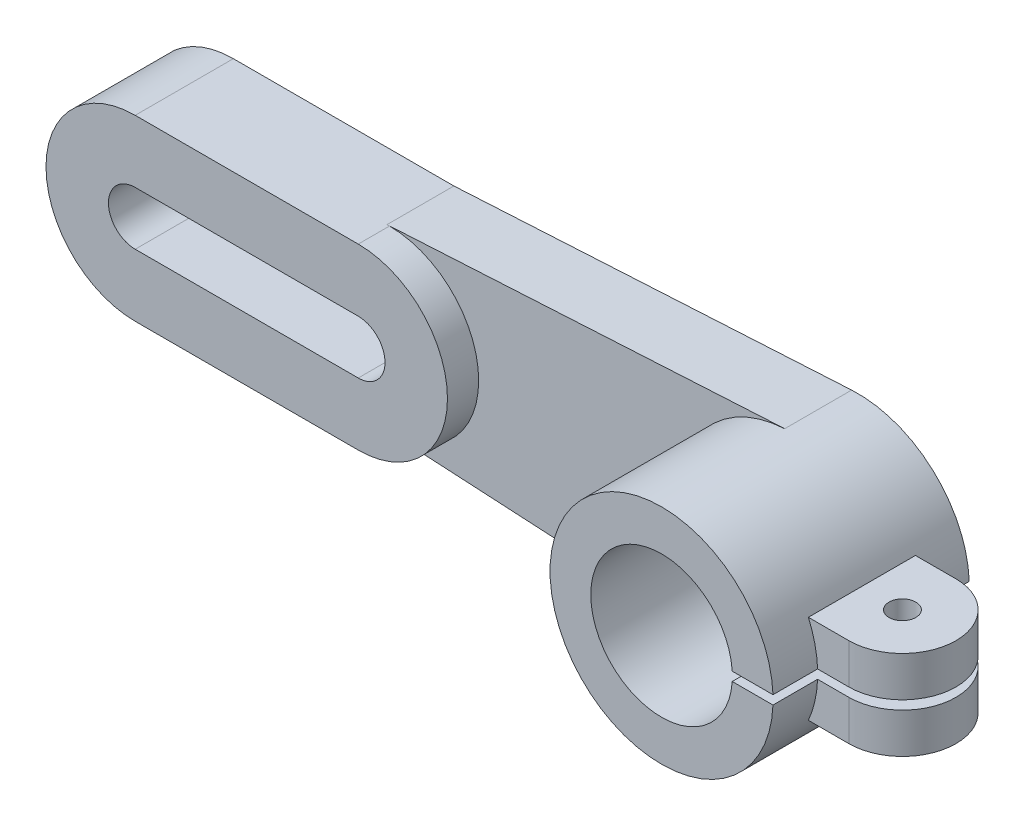
ISO-10303-21;
HEADER;
FILE_DESCRIPTION(('STEP AP214'),'2;1');
FILE_NAME('part.step','',(''),(''),'','','');
FILE_SCHEMA(('AUTOMOTIVE_DESIGN { 1 0 10303 214 1 1 1 1 }'));
ENDSEC;
DATA;
#1=APPLICATION_CONTEXT('core data for automotive mechanical design processes');
#2=APPLICATION_PROTOCOL_DEFINITION('international standard','automotive_design',2000,#1);
#3=PRODUCT_CONTEXT('',#1,'mechanical');
#4=PRODUCT('Part','Part','',(#3));
#5=PRODUCT_RELATED_PRODUCT_CATEGORY('part','',(#4));
#6=PRODUCT_DEFINITION_FORMATION('','',#4);
#7=PRODUCT_DEFINITION_CONTEXT('part definition',#1,'design');
#8=PRODUCT_DEFINITION('design','',#6,#7);
#9=PRODUCT_DEFINITION_SHAPE('','',#8);
#10=(LENGTH_UNIT() NAMED_UNIT(*) SI_UNIT(.MILLI.,.METRE.));
#11=(NAMED_UNIT(*) PLANE_ANGLE_UNIT() SI_UNIT($,.RADIAN.));
#12=(NAMED_UNIT(*) SI_UNIT($,.STERADIAN.) SOLID_ANGLE_UNIT());
#13=UNCERTAINTY_MEASURE_WITH_UNIT(LENGTH_MEASURE(1.E-05),#10,'distance_accuracy_value','');
#14=(GEOMETRIC_REPRESENTATION_CONTEXT(3) GLOBAL_UNCERTAINTY_ASSIGNED_CONTEXT((#13)) GLOBAL_UNIT_ASSIGNED_CONTEXT((#10,
#11,#12)) REPRESENTATION_CONTEXT('',''));
#15=CARTESIAN_POINT('',(0.,0.,0.));
#16=DIRECTION('',(0.,0.,1.));
#17=DIRECTION('',(1.,0.,0.));
#18=AXIS2_PLACEMENT_3D('',#15,#16,#17);
#19=CARTESIAN_POINT('',(0.,10.,-34.));
#20=DIRECTION('',(0.,-1.,0.));
#21=DIRECTION('',(1.,0.,0.));
#22=AXIS2_PLACEMENT_3D('',#19,#20,#21);
#23=PLANE('',#22);
#24=DIRECTION('',(1.,0.,0.));
#25=VECTOR('',#24,1.);
#26=CARTESIAN_POINT('',(0.,10.,-10.));
#27=LINE('',#26,#25);
#28=CARTESIAN_POINT('',(22.9128784747792,10.,-10.));
#29=VERTEX_POINT('',#28);
#30=CARTESIAN_POINT('',(32.,10.,-10.));
#31=VERTEX_POINT('',#30);
#32=EDGE_CURVE('E380',#29,#31,#27,.T.);
#33=ORIENTED_EDGE('',*,*,#32,.T.);
#34=CARTESIAN_POINT('',(32.,10.,-22.));
#35=DIRECTION('',(0.,-1.,0.));
#36=DIRECTION('',(1.,0.,0.));
#37=AXIS2_PLACEMENT_3D('',#34,#35,#36);
#38=CIRCLE('',#37,12.);
#39=CARTESIAN_POINT('',(32.,10.,-34.));
#40=VERTEX_POINT('',#39);
#41=EDGE_CURVE('E458',#31,#40,#38,.F.);
#42=ORIENTED_EDGE('',*,*,#41,.T.);
#43=DIRECTION('',(1.,0.,0.));
#44=VECTOR('',#43,1.);
#45=CARTESIAN_POINT('',(0.,10.,-34.));
#46=LINE('',#45,#44);
#47=CARTESIAN_POINT('',(22.9128784747792,10.,-34.));
#48=VERTEX_POINT('',#47);
#49=EDGE_CURVE('E384',#48,#40,#46,.T.);
#50=ORIENTED_EDGE('',*,*,#49,.F.);
#51=DIRECTION('',(0.,0.,1.));
#52=VECTOR('',#51,1.);
#53=CARTESIAN_POINT('',(22.9128784747792,10.,-34.));
#54=LINE('',#53,#52);
#55=EDGE_CURVE('E388',#48,#29,#54,.T.);
#56=ORIENTED_EDGE('',*,*,#55,.T.);
#57=EDGE_LOOP('',(#33,#42,#50,#56));
#58=FACE_BOUND('',#57,.T.);
#59=CARTESIAN_POINT('',(32.,10.,-22.));
#60=DIRECTION('',(0.,1.,0.));
#61=DIRECTION('',(0.,0.,1.));
#62=AXIS2_PLACEMENT_3D('',#59,#60,#61);
#63=CIRCLE('',#62,3.);
#64=CARTESIAN_POINT('',(32.,10.,-19.));
#65=VERTEX_POINT('',#64);
#66=EDGE_CURVE('E828',#65,#65,#63,.T.);
#67=ORIENTED_EDGE('',*,*,#66,.F.);
#68=EDGE_LOOP('',(#67));
#69=FACE_BOUND('',#68,.T.);
#70=ADVANCED_FACE('F45',(#58,#69),#23,.F.);
#71=CARTESIAN_POINT('',(32.,-10.,-22.));
#72=DIRECTION('',(0.,-1.,0.));
#73=DIRECTION('',(0.,0.,-1.));
#74=AXIS2_PLACEMENT_3D('',#71,#72,#73);
#75=CYLINDRICAL_SURFACE('',#74,12.);
#76=DIRECTION('',(0.,1.,0.));
#77=VECTOR('',#76,1.);
#78=CARTESIAN_POINT('',(32.,-10.,-10.));
#79=LINE('',#78,#77);
#80=CARTESIAN_POINT('',(32.,-10.,-10.));
#81=VERTEX_POINT('',#80);
#82=CARTESIAN_POINT('',(32.,-0.999999999999997,-10.));
#83=VERTEX_POINT('',#82);
#84=EDGE_CURVE('E461',#81,#83,#79,.T.);
#85=ORIENTED_EDGE('',*,*,#84,.F.);
#86=CARTESIAN_POINT('',(32.,-10.,-22.));
#87=DIRECTION('',(0.,-1.,0.));
#88=DIRECTION('',(1.,0.,0.));
#89=AXIS2_PLACEMENT_3D('',#86,#87,#88);
#90=CIRCLE('',#89,12.);
#91=CARTESIAN_POINT('',(32.,-10.,-34.));
#92=VERTEX_POINT('',#91);
#93=EDGE_CURVE('E56',#92,#81,#90,.T.);
#94=ORIENTED_EDGE('',*,*,#93,.F.);
#95=DIRECTION('',(0.,-1.,0.));
#96=VECTOR('',#95,1.);
#97=CARTESIAN_POINT('',(32.,0.,-34.));
#98=LINE('',#97,#96);
#99=CARTESIAN_POINT('',(32.,-0.999999999999997,-34.));
#100=VERTEX_POINT('',#99);
#101=EDGE_CURVE('E465',#100,#92,#98,.T.);
#102=ORIENTED_EDGE('',*,*,#101,.F.);
#103=CARTESIAN_POINT('',(32.,-0.999999999999997,-22.));
#104=DIRECTION('',(0.,-1.,0.));
#105=DIRECTION('',(1.,0.,0.));
#106=AXIS2_PLACEMENT_3D('',#103,#104,#105);
#107=CIRCLE('',#106,12.);
#108=EDGE_CURVE('E11',#83,#100,#107,.F.);
#109=ORIENTED_EDGE('',*,*,#108,.F.);
#110=EDGE_LOOP('',(#85,#94,#102,#109));
#111=FACE_BOUND('',#110,.T.);
#112=ADVANCED_FACE('F48',(#111),#75,.T.);
#113=CARTESIAN_POINT('',(32.,1.,-22.));
#114=DIRECTION('',(0.,1.,0.));
#115=DIRECTION('',(0.,0.,1.));
#116=AXIS2_PLACEMENT_3D('',#113,#114,#115);
#117=CYLINDRICAL_SURFACE('',#116,12.);
#118=DIRECTION('',(0.,1.,0.));
#119=VECTOR('',#118,1.);
#120=CARTESIAN_POINT('',(32.,0.,-10.));
#121=LINE('',#120,#119);
#122=CARTESIAN_POINT('',(32.,1.,-10.));
#123=VERTEX_POINT('',#122);
#124=EDGE_CURVE('E435',#123,#31,#121,.T.);
#125=ORIENTED_EDGE('',*,*,#124,.F.);
#126=CARTESIAN_POINT('',(32.,1.,-22.));
#127=DIRECTION('',(0.,-1.,0.));
#128=DIRECTION('',(0.,0.,-1.));
#129=AXIS2_PLACEMENT_3D('',#126,#127,#128);
#130=CIRCLE('',#129,12.);
#131=CARTESIAN_POINT('',(32.,1.,-34.));
#132=VERTEX_POINT('',#131);
#133=EDGE_CURVE('E455',#132,#123,#130,.T.);
#134=ORIENTED_EDGE('',*,*,#133,.F.);
#135=DIRECTION('',(0.,-1.,0.));
#136=VECTOR('',#135,1.);
#137=CARTESIAN_POINT('',(32.,1.,-34.));
#138=LINE('',#137,#136);
#139=EDGE_CURVE('E451',#40,#132,#138,.T.);
#140=ORIENTED_EDGE('',*,*,#139,.F.);
#141=ORIENTED_EDGE('',*,*,#41,.F.);
#142=EDGE_LOOP('',(#125,#134,#140,#141));
#143=FACE_BOUND('',#142,.T.);
#144=ADVANCED_FACE('F510',(#143),#117,.T.);
#145=CARTESIAN_POINT('',(0.,0.,-44.));
#146=DIRECTION('',(0.,0.,1.));
#147=DIRECTION('',(1.,0.,0.));
#148=AXIS2_PLACEMENT_3D('',#145,#146,#147);
#149=CYLINDRICAL_SURFACE('',#148,25.);
#150=DIRECTION('',(0.,0.,1.));
#151=VECTOR('',#150,1.);
#152=CARTESIAN_POINT('',(-1.38888888888889,24.9613899383492,-44.));
#153=LINE('',#152,#151);
#154=CARTESIAN_POINT('',(-1.38888888888889,24.9613899383492,-44.));
#155=VERTEX_POINT('',#154);
#156=CARTESIAN_POINT('',(-1.38888888888889,24.9613899383492,-29.));
#157=VERTEX_POINT('',#156);
#158=EDGE_CURVE('E339',#155,#157,#153,.T.);
#159=ORIENTED_EDGE('',*,*,#158,.T.);
#160=CARTESIAN_POINT('',(0.,0.,-29.));
#161=DIRECTION('',(0.,0.,1.));
#162=DIRECTION('',(1.,0.,0.));
#163=AXIS2_PLACEMENT_3D('',#160,#161,#162);
#164=CIRCLE('',#163,25.);
#165=CARTESIAN_POINT('',(-1.3888888888889,-24.9613899383492,-29.));
#166=VERTEX_POINT('',#165);
#167=EDGE_CURVE('E327',#157,#166,#164,.T.);
#168=ORIENTED_EDGE('',*,*,#167,.T.);
#169=DIRECTION('',(0.,0.,1.));
#170=VECTOR('',#169,1.);
#171=CARTESIAN_POINT('',(-1.3888888888889,-24.9613899383492,-44.));
#172=LINE('',#171,#170);
#173=CARTESIAN_POINT('',(-1.3888888888889,-24.9613899383492,-44.));
#174=VERTEX_POINT('',#173);
#175=EDGE_CURVE('E342',#174,#166,#172,.T.);
#176=ORIENTED_EDGE('',*,*,#175,.F.);
#177=CARTESIAN_POINT('',(0.,0.,-44.));
#178=DIRECTION('',(0.,0.,1.));
#179=DIRECTION('',(1.,0.,0.));
#180=AXIS2_PLACEMENT_3D('',#177,#178,#179);
#181=CIRCLE('',#180,25.);
#182=CARTESIAN_POINT('',(24.9799919935936,-0.999999999999998,-44.));
#183=VERTEX_POINT('',#182);
#184=EDGE_CURVE('E406',#174,#183,#181,.T.);
#185=ORIENTED_EDGE('',*,*,#184,.T.);
#186=DIRECTION('',(0.,0.,1.));
#187=VECTOR('',#186,1.);
#188=CARTESIAN_POINT('',(24.9799919935936,-0.999999999999998,-44.));
#189=LINE('',#188,#187);
#190=CARTESIAN_POINT('',(24.9799919935936,-0.999999999999998,-34.));
#191=VERTEX_POINT('',#190);
#192=EDGE_CURVE('E440',#183,#191,#189,.T.);
#193=ORIENTED_EDGE('',*,*,#192,.T.);
#194=CARTESIAN_POINT('',(0.,0.,-34.));
#195=DIRECTION('',(0.,0.,1.));
#196=DIRECTION('',(1.,0.,0.));
#197=AXIS2_PLACEMENT_3D('',#194,#195,#196);
#198=CIRCLE('',#197,25.);
#199=CARTESIAN_POINT('',(22.9128784747792,-10.,-34.));
#200=VERTEX_POINT('',#199);
#201=EDGE_CURVE('E349',#200,#191,#198,.T.);
#202=ORIENTED_EDGE('',*,*,#201,.F.);
#203=DIRECTION('',(0.,0.,1.));
#204=VECTOR('',#203,1.);
#205=CARTESIAN_POINT('',(22.9128784747792,-10.,-34.));
#206=LINE('',#205,#204);
#207=CARTESIAN_POINT('',(22.9128784747792,-10.,-10.));
#208=VERTEX_POINT('',#207);
#209=EDGE_CURVE('E362',#200,#208,#206,.T.);
#210=ORIENTED_EDGE('',*,*,#209,.T.);
#211=CARTESIAN_POINT('',(0.,0.,-10.));
#212=DIRECTION('',(0.,0.,1.));
#213=DIRECTION('',(1.,0.,0.));
#214=AXIS2_PLACEMENT_3D('',#211,#212,#213);
#215=CIRCLE('',#214,25.);
#216=CARTESIAN_POINT('',(24.9799919935936,-0.999999999999998,-10.));
#217=VERTEX_POINT('',#216);
#218=EDGE_CURVE('E338',#208,#217,#215,.T.);
#219=ORIENTED_EDGE('',*,*,#218,.T.);
#220=CARTESIAN_POINT('',(24.9799919935936,-0.999999999999998,0.));
#221=VERTEX_POINT('',#220);
#222=EDGE_CURVE('E443',#217,#221,#189,.T.);
#223=ORIENTED_EDGE('',*,*,#222,.T.);
#224=CARTESIAN_POINT('',(0.,0.,0.));
#225=DIRECTION('',(0.,0.,1.));
#226=DIRECTION('',(1.,0.,0.));
#227=AXIS2_PLACEMENT_3D('',#224,#225,#226);
#228=CIRCLE('',#227,25.);
#229=CARTESIAN_POINT('',(24.9799919935936,1.,0.));
#230=VERTEX_POINT('',#229);
#231=EDGE_CURVE('E422',#230,#221,#228,.T.);
#232=ORIENTED_EDGE('',*,*,#231,.F.);
#233=DIRECTION('',(0.,0.,1.));
#234=VECTOR('',#233,1.);
#235=CARTESIAN_POINT('',(24.9799919935936,1.,-44.));
#236=LINE('',#235,#234);
#237=CARTESIAN_POINT('',(24.9799919935936,1.,-10.));
#238=VERTEX_POINT('',#237);
#239=EDGE_CURVE('E418',#238,#230,#236,.T.);
#240=ORIENTED_EDGE('',*,*,#239,.F.);
#241=CARTESIAN_POINT('',(0.,0.,-10.));
#242=DIRECTION('',(0.,0.,1.));
#243=DIRECTION('',(1.,0.,0.));
#244=AXIS2_PLACEMENT_3D('',#241,#242,#243);
#245=CIRCLE('',#244,25.);
#246=EDGE_CURVE('E374',#238,#29,#245,.T.);
#247=ORIENTED_EDGE('',*,*,#246,.T.);
#248=ORIENTED_EDGE('',*,*,#55,.F.);
#249=CARTESIAN_POINT('',(0.,0.,-34.));
#250=DIRECTION('',(0.,0.,1.));
#251=DIRECTION('',(1.,0.,0.));
#252=AXIS2_PLACEMENT_3D('',#249,#250,#251);
#253=CIRCLE('',#252,25.);
#254=CARTESIAN_POINT('',(24.9799919935936,1.,-34.));
#255=VERTEX_POINT('',#254);
#256=EDGE_CURVE('E375',#255,#48,#253,.T.);
#257=ORIENTED_EDGE('',*,*,#256,.F.);
#258=CARTESIAN_POINT('',(24.9799919935936,1.,-44.));
#259=VERTEX_POINT('',#258);
#260=EDGE_CURVE('E444',#259,#255,#236,.T.);
#261=ORIENTED_EDGE('',*,*,#260,.F.);
#262=EDGE_CURVE('E408',#259,#155,#181,.T.);
#263=ORIENTED_EDGE('',*,*,#262,.T.);
#264=EDGE_LOOP('',(#159,#168,#176,#185,#193,#202,#210,#219,#223,#232,#240,#247,#248,#257,#261,#263));
#265=FACE_BOUND('',#264,.T.);
#266=ADVANCED_FACE('F479',(#265),#149,.T.);
#267=CARTESIAN_POINT('',(0.,1.,-44.));
#268=DIRECTION('',(0.,-1.,0.));
#269=DIRECTION('',(0.,0.,-1.));
#270=AXIS2_PLACEMENT_3D('',#267,#268,#269);
#271=PLANE('',#270);
#272=CARTESIAN_POINT('',(32.,0.999999999999999,-22.));
#273=DIRECTION('',(0.,-1.,0.));
#274=DIRECTION('',(0.,0.,-1.));
#275=AXIS2_PLACEMENT_3D('',#272,#273,#274);
#276=CIRCLE('',#275,3.);
#277=CARTESIAN_POINT('',(32.,0.999999999999999,-25.));
#278=VERTEX_POINT('',#277);
#279=EDGE_CURVE('E260',#278,#278,#276,.T.);
#280=ORIENTED_EDGE('',*,*,#279,.F.);
#281=EDGE_LOOP('',(#280));
#282=FACE_BOUND('',#281,.T.);
#283=DIRECTION('',(1.,0.,0.));
#284=VECTOR('',#283,1.);
#285=CARTESIAN_POINT('',(0.,1.,-34.));
#286=LINE('',#285,#284);
#287=EDGE_CURVE('E379',#255,#132,#286,.T.);
#288=ORIENTED_EDGE('',*,*,#287,.T.);
#289=ORIENTED_EDGE('',*,*,#133,.T.);
#290=DIRECTION('',(1.,0.,0.));
#291=VECTOR('',#290,1.);
#292=CARTESIAN_POINT('',(0.,1.,-10.));
#293=LINE('',#292,#291);
#294=EDGE_CURVE('E391',#238,#123,#293,.T.);
#295=ORIENTED_EDGE('',*,*,#294,.F.);
#296=ORIENTED_EDGE('',*,*,#239,.T.);
#297=DIRECTION('',(1.,0.,0.));
#298=VECTOR('',#297,1.);
#299=CARTESIAN_POINT('',(0.,1.,0.));
#300=LINE('',#299,#298);
#301=CARTESIAN_POINT('',(15.8359576991731,1.,0.));
#302=VERTEX_POINT('',#301);
#303=EDGE_CURVE('E401',#302,#230,#300,.T.);
#304=ORIENTED_EDGE('',*,*,#303,.F.);
#305=DIRECTION('',(0.,0.,1.));
#306=VECTOR('',#305,1.);
#307=CARTESIAN_POINT('',(15.8359576991731,1.,-44.));
#308=LINE('',#307,#306);
#309=CARTESIAN_POINT('',(15.8359576991731,1.,-44.));
#310=VERTEX_POINT('',#309);
#311=EDGE_CURVE('E432',#310,#302,#308,.T.);
#312=ORIENTED_EDGE('',*,*,#311,.F.);
#313=DIRECTION('',(1.,0.,0.));
#314=VECTOR('',#313,1.);
#315=CARTESIAN_POINT('',(0.,1.,-44.));
#316=LINE('',#315,#314);
#317=EDGE_CURVE('E402',#310,#259,#316,.T.);
#318=ORIENTED_EDGE('',*,*,#317,.T.);
#319=ORIENTED_EDGE('',*,*,#260,.T.);
#320=EDGE_LOOP('',(#288,#289,#295,#296,#304,#312,#318,#319));
#321=FACE_BOUND('',#320,.T.);
#322=ADVANCED_FACE('F505',(#282,#321),#271,.T.);
#323=CARTESIAN_POINT('',(0.,0.,-44.));
#324=DIRECTION('',(0.,0.,1.));
#325=DIRECTION('',(1.,0.,0.));
#326=AXIS2_PLACEMENT_3D('',#323,#324,#325);
#327=CYLINDRICAL_SURFACE('',#326,15.8675);
#328=CARTESIAN_POINT('',(0.,0.,0.));
#329=DIRECTION('',(0.,0.,1.));
#330=DIRECTION('',(1.,0.,0.));
#331=AXIS2_PLACEMENT_3D('',#328,#329,#330);
#332=CIRCLE('',#331,15.8675);
#333=CARTESIAN_POINT('',(15.8359576991731,-1.,0.));
#334=VERTEX_POINT('',#333);
#335=EDGE_CURVE('E407',#302,#334,#332,.T.);
#336=ORIENTED_EDGE('',*,*,#335,.T.);
#337=DIRECTION('',(0.,0.,1.));
#338=VECTOR('',#337,1.);
#339=CARTESIAN_POINT('',(15.8359576991731,-1.,-44.));
#340=LINE('',#339,#338);
#341=CARTESIAN_POINT('',(15.8359576991731,-1.,-44.));
#342=VERTEX_POINT('',#341);
#343=EDGE_CURVE('E436',#342,#334,#340,.T.);
#344=ORIENTED_EDGE('',*,*,#343,.F.);
#345=CARTESIAN_POINT('',(0.,0.,-44.));
#346=DIRECTION('',(0.,0.,1.));
#347=DIRECTION('',(1.,0.,0.));
#348=AXIS2_PLACEMENT_3D('',#345,#346,#347);
#349=CIRCLE('',#348,15.8675);
#350=EDGE_CURVE('E415',#310,#342,#349,.T.);
#351=ORIENTED_EDGE('',*,*,#350,.F.);
#352=ORIENTED_EDGE('',*,*,#311,.T.);
#353=EDGE_LOOP('',(#336,#344,#351,#352));
#354=FACE_BOUND('',#353,.T.);
#355=ADVANCED_FACE('F492',(#354),#327,.F.);
#356=CARTESIAN_POINT('',(0.,-1.,-44.));
#357=DIRECTION('',(0.,-1.,0.));
#358=DIRECTION('',(1.,0.,0.));
#359=AXIS2_PLACEMENT_3D('',#356,#357,#358);
#360=PLANE('',#359);
#361=CARTESIAN_POINT('',(32.,-0.999999999999997,-22.));
#362=DIRECTION('',(0.,-1.,0.));
#363=DIRECTION('',(1.,0.,0.));
#364=AXIS2_PLACEMENT_3D('',#361,#362,#363);
#365=CIRCLE('',#364,3.);
#366=CARTESIAN_POINT('',(35.,-0.999999999999997,-22.));
#367=VERTEX_POINT('',#366);
#368=EDGE_CURVE('E833',#367,#367,#365,.T.);
#369=ORIENTED_EDGE('',*,*,#368,.T.);
#370=EDGE_LOOP('',(#369));
#371=FACE_BOUND('',#370,.T.);
#372=DIRECTION('',(1.,0.,0.));
#373=VECTOR('',#372,1.);
#374=CARTESIAN_POINT('',(0.,-1.,-10.));
#375=LINE('',#374,#373);
#376=EDGE_CURVE('E354',#217,#83,#375,.T.);
#377=ORIENTED_EDGE('',*,*,#376,.T.);
#378=ORIENTED_EDGE('',*,*,#108,.T.);
#379=DIRECTION('',(1.,0.,0.));
#380=VECTOR('',#379,1.);
#381=CARTESIAN_POINT('',(0.,-1.,-34.));
#382=LINE('',#381,#380);
#383=EDGE_CURVE('E358',#191,#100,#382,.T.);
#384=ORIENTED_EDGE('',*,*,#383,.F.);
#385=ORIENTED_EDGE('',*,*,#192,.F.);
#386=DIRECTION('',(1.,0.,0.));
#387=VECTOR('',#386,1.);
#388=CARTESIAN_POINT('',(0.,-1.,-44.));
#389=LINE('',#388,#387);
#390=EDGE_CURVE('E411',#342,#183,#389,.T.);
#391=ORIENTED_EDGE('',*,*,#390,.F.);
#392=ORIENTED_EDGE('',*,*,#343,.T.);
#393=DIRECTION('',(1.,0.,0.));
#394=VECTOR('',#393,1.);
#395=CARTESIAN_POINT('',(0.,-1.,0.));
#396=LINE('',#395,#394);
#397=EDGE_CURVE('E426',#334,#221,#396,.T.);
#398=ORIENTED_EDGE('',*,*,#397,.T.);
#399=ORIENTED_EDGE('',*,*,#222,.F.);
#400=EDGE_LOOP('',(#377,#378,#384,#385,#391,#392,#398,#399));
#401=FACE_BOUND('',#400,.T.);
#402=ADVANCED_FACE('F484',(#371,#401),#360,.F.);
#403=CARTESIAN_POINT('',(0.,0.,-44.));
#404=DIRECTION('',(0.,0.,1.));
#405=DIRECTION('',(1.,0.,0.));
#406=AXIS2_PLACEMENT_3D('',#403,#404,#405);
#407=PLANE('',#406);
#408=ORIENTED_EDGE('',*,*,#317,.F.);
#409=ORIENTED_EDGE('',*,*,#350,.T.);
#410=ORIENTED_EDGE('',*,*,#390,.T.);
#411=ORIENTED_EDGE('',*,*,#184,.F.);
#412=DIRECTION('',(0.998455597533968,-0.0555555555555561,0.));
#413=VECTOR('',#412,1.);
#414=CARTESIAN_POINT('',(-1.3888888888889,-24.9613899383492,-44.));
#415=LINE('',#414,#413);
#416=CARTESIAN_POINT('',(-90.5559848877706,-20.,-44.));
#417=VERTEX_POINT('',#416);
#418=EDGE_CURVE('E307',#417,#174,#415,.T.);
#419=ORIENTED_EDGE('',*,*,#418,.F.);
#420=DIRECTION('',(1.,0.,0.));
#421=VECTOR('',#420,1.);
#422=CARTESIAN_POINT('',(0.,-20.,-44.));
#423=LINE('',#422,#421);
#424=CARTESIAN_POINT('',(-140.,-20.,-44.));
#425=VERTEX_POINT('',#424);
#426=EDGE_CURVE('E238',#425,#417,#423,.T.);
#427=ORIENTED_EDGE('',*,*,#426,.F.);
#428=CARTESIAN_POINT('',(-140.,0.,-44.));
#429=DIRECTION('',(0.,0.,1.));
#430=DIRECTION('',(1.,0.,0.));
#431=AXIS2_PLACEMENT_3D('',#428,#429,#430);
#432=CIRCLE('',#431,20.);
#433=CARTESIAN_POINT('',(-140.,20.,-44.));
#434=VERTEX_POINT('',#433);
#435=EDGE_CURVE('E211',#434,#425,#432,.T.);
#436=ORIENTED_EDGE('',*,*,#435,.F.);
#437=DIRECTION('',(1.,0.,0.));
#438=VECTOR('',#437,1.);
#439=CARTESIAN_POINT('',(0.,19.9999999999998,-44.));
#440=LINE('',#439,#438);
#441=CARTESIAN_POINT('',(-90.5559848877729,19.9999999999999,-44.));
#442=VERTEX_POINT('',#441);
#443=EDGE_CURVE('E223',#434,#442,#440,.T.);
#444=ORIENTED_EDGE('',*,*,#443,.T.);
#445=DIRECTION('',(0.998455597533968,0.0555555555555557,0.));
#446=VECTOR('',#445,1.);
#447=CARTESIAN_POINT('',(-1.38888888888889,24.9613899383492,-44.));
#448=LINE('',#447,#446);
#449=EDGE_CURVE('E311',#442,#155,#448,.T.);
#450=ORIENTED_EDGE('',*,*,#449,.T.);
#451=ORIENTED_EDGE('',*,*,#262,.F.);
#452=EDGE_LOOP('',(#408,#409,#410,#411,#419,#427,#436,#444,#450,#451));
#453=FACE_BOUND('',#452,.T.);
#454=CARTESIAN_POINT('',(-90.,0.,-44.));
#455=DIRECTION('',(0.,0.,1.));
#456=DIRECTION('',(1.,0.,0.));
#457=AXIS2_PLACEMENT_3D('',#454,#455,#456);
#458=CIRCLE('',#457,5.99999999999995);
#459=CARTESIAN_POINT('',(-90.,-5.99999999999993,-44.));
#460=VERTEX_POINT('',#459);
#461=CARTESIAN_POINT('',(-90.,5.99999999999997,-44.));
#462=VERTEX_POINT('',#461);
#463=EDGE_CURVE('E242',#460,#462,#458,.T.);
#464=ORIENTED_EDGE('',*,*,#463,.T.);
#465=DIRECTION('',(1.,0.,0.));
#466=VECTOR('',#465,1.);
#467=CARTESIAN_POINT('',(0.,5.99999999999977,-44.));
#468=LINE('',#467,#466);
#469=CARTESIAN_POINT('',(-140.,6.00000000000008,-44.));
#470=VERTEX_POINT('',#469);
#471=EDGE_CURVE('E219',#470,#462,#468,.T.);
#472=ORIENTED_EDGE('',*,*,#471,.F.);
#473=CARTESIAN_POINT('',(-140.,0.,-44.));
#474=DIRECTION('',(0.,0.,1.));
#475=DIRECTION('',(1.,0.,0.));
#476=AXIS2_PLACEMENT_3D('',#473,#474,#475);
#477=CIRCLE('',#476,6.);
#478=CARTESIAN_POINT('',(-140.,-5.99999999999992,-44.));
#479=VERTEX_POINT('',#478);
#480=EDGE_CURVE('E251',#470,#479,#477,.T.);
#481=ORIENTED_EDGE('',*,*,#480,.T.);
#482=DIRECTION('',(1.,0.,0.));
#483=VECTOR('',#482,1.);
#484=CARTESIAN_POINT('',(0.,-5.99999999999995,-44.));
#485=LINE('',#484,#483);
#486=EDGE_CURVE('E248',#479,#460,#485,.T.);
#487=ORIENTED_EDGE('',*,*,#486,.T.);
#488=EDGE_LOOP('',(#464,#472,#481,#487));
#489=FACE_BOUND('',#488,.T.);
#490=ADVANCED_FACE('F234',(#453,#489),#407,.F.);
#491=CARTESIAN_POINT('',(0.,0.,0.));
#492=DIRECTION('',(0.,0.,1.));
#493=DIRECTION('',(1.,0.,0.));
#494=AXIS2_PLACEMENT_3D('',#491,#492,#493);
#495=PLANE('',#494);
#496=ORIENTED_EDGE('',*,*,#303,.T.);
#497=ORIENTED_EDGE('',*,*,#231,.T.);
#498=ORIENTED_EDGE('',*,*,#397,.F.);
#499=ORIENTED_EDGE('',*,*,#335,.F.);
#500=EDGE_LOOP('',(#496,#497,#498,#499));
#501=FACE_BOUND('',#500,.T.);
#502=ADVANCED_FACE('F496',(#501),#495,.T.);
#503=CARTESIAN_POINT('',(0.,0.,-34.));
#504=DIRECTION('',(0.,0.,1.));
#505=DIRECTION('',(1.,0.,0.));
#506=AXIS2_PLACEMENT_3D('',#503,#504,#505);
#507=PLANE('',#506);
#508=ORIENTED_EDGE('',*,*,#49,.T.);
#509=ORIENTED_EDGE('',*,*,#139,.T.);
#510=ORIENTED_EDGE('',*,*,#287,.F.);
#511=ORIENTED_EDGE('',*,*,#256,.T.);
#512=EDGE_LOOP('',(#508,#509,#510,#511));
#513=FACE_BOUND('',#512,.T.);
#514=ADVANCED_FACE('F515',(#513),#507,.F.);
#515=CARTESIAN_POINT('',(0.,0.,-10.));
#516=DIRECTION('',(0.,0.,1.));
#517=DIRECTION('',(1.,0.,0.));
#518=AXIS2_PLACEMENT_3D('',#515,#516,#517);
#519=PLANE('',#518);
#520=ORIENTED_EDGE('',*,*,#294,.T.);
#521=ORIENTED_EDGE('',*,*,#124,.T.);
#522=ORIENTED_EDGE('',*,*,#32,.F.);
#523=ORIENTED_EDGE('',*,*,#246,.F.);
#524=EDGE_LOOP('',(#520,#521,#522,#523));
#525=FACE_BOUND('',#524,.T.);
#526=ADVANCED_FACE('F504',(#525),#519,.T.);
#527=CARTESIAN_POINT('',(0.,-10.,-34.));
#528=DIRECTION('',(0.,-1.,0.));
#529=DIRECTION('',(1.,0.,0.));
#530=AXIS2_PLACEMENT_3D('',#527,#528,#529);
#531=PLANE('',#530);
#532=CARTESIAN_POINT('',(32.,-10.,-22.));
#533=DIRECTION('',(0.,-1.,0.));
#534=DIRECTION('',(1.,0.,0.));
#535=AXIS2_PLACEMENT_3D('',#532,#533,#534);
#536=CIRCLE('',#535,3.);
#537=CARTESIAN_POINT('',(35.,-10.,-22.));
#538=VERTEX_POINT('',#537);
#539=EDGE_CURVE('E50',#538,#538,#536,.T.);
#540=ORIENTED_EDGE('',*,*,#539,.F.);
#541=EDGE_LOOP('',(#540));
#542=FACE_BOUND('',#541,.T.);
#543=DIRECTION('',(1.,0.,0.));
#544=VECTOR('',#543,1.);
#545=CARTESIAN_POINT('',(0.,-10.,-34.));
#546=LINE('',#545,#544);
#547=EDGE_CURVE('E353',#200,#92,#546,.T.);
#548=ORIENTED_EDGE('',*,*,#547,.T.);
#549=ORIENTED_EDGE('',*,*,#93,.T.);
#550=DIRECTION('',(1.,0.,0.));
#551=VECTOR('',#550,1.);
#552=CARTESIAN_POINT('',(0.,-10.,-10.));
#553=LINE('',#552,#551);
#554=EDGE_CURVE('E366',#208,#81,#553,.T.);
#555=ORIENTED_EDGE('',*,*,#554,.F.);
#556=ORIENTED_EDGE('',*,*,#209,.F.);
#557=EDGE_LOOP('',(#548,#549,#555,#556));
#558=FACE_BOUND('',#557,.T.);
#559=ADVANCED_FACE('F471',(#542,#558),#531,.T.);
#560=CARTESIAN_POINT('',(0.,0.,-34.));
#561=DIRECTION('',(0.,0.,1.));
#562=DIRECTION('',(1.,0.,0.));
#563=AXIS2_PLACEMENT_3D('',#560,#561,#562);
#564=PLANE('',#563);
#565=ORIENTED_EDGE('',*,*,#383,.T.);
#566=ORIENTED_EDGE('',*,*,#101,.T.);
#567=ORIENTED_EDGE('',*,*,#547,.F.);
#568=ORIENTED_EDGE('',*,*,#201,.T.);
#569=EDGE_LOOP('',(#565,#566,#567,#568));
#570=FACE_BOUND('',#569,.T.);
#571=ADVANCED_FACE('F482',(#570),#564,.F.);
#572=CARTESIAN_POINT('',(0.,0.,-10.));
#573=DIRECTION('',(0.,0.,1.));
#574=DIRECTION('',(1.,0.,0.));
#575=AXIS2_PLACEMENT_3D('',#572,#573,#574);
#576=PLANE('',#575);
#577=ORIENTED_EDGE('',*,*,#554,.T.);
#578=ORIENTED_EDGE('',*,*,#84,.T.);
#579=ORIENTED_EDGE('',*,*,#376,.F.);
#580=ORIENTED_EDGE('',*,*,#218,.F.);
#581=EDGE_LOOP('',(#577,#578,#579,#580));
#582=FACE_BOUND('',#581,.T.);
#583=ADVANCED_FACE('F477',(#582),#576,.T.);
#584=CARTESIAN_POINT('',(-1.38888888888889,24.9613899383492,-44.));
#585=DIRECTION('',(0.0555555555555557,-0.998455597533968,0.));
#586=DIRECTION('',(0.998455597533968,0.0555555555555557,0.));
#587=AXIS2_PLACEMENT_3D('',#584,#585,#586);
#588=PLANE('',#587);
#589=DIRECTION('',(0.998455597533968,0.0555555555555557,0.));
#590=VECTOR('',#589,1.);
#591=CARTESIAN_POINT('',(-1.38888888888889,24.9613899383492,-29.));
#592=LINE('',#591,#590);
#593=CARTESIAN_POINT('',(-90.5559848877729,19.9999999999999,-29.));
#594=VERTEX_POINT('',#593);
#595=EDGE_CURVE('E330',#594,#157,#592,.T.);
#596=ORIENTED_EDGE('',*,*,#595,.T.);
#597=ORIENTED_EDGE('',*,*,#158,.F.);
#598=ORIENTED_EDGE('',*,*,#449,.F.);
#599=DIRECTION('',(0.,0.,1.));
#600=VECTOR('',#599,1.);
#601=CARTESIAN_POINT('',(-90.5559848877729,19.9999999999999,-44.));
#602=LINE('',#601,#600);
#603=EDGE_CURVE('E226',#442,#594,#602,.T.);
#604=ORIENTED_EDGE('',*,*,#603,.T.);
#605=EDGE_LOOP('',(#596,#597,#598,#604));
#606=FACE_BOUND('',#605,.T.);
#607=ADVANCED_FACE('F642',(#606),#588,.F.);
#608=CARTESIAN_POINT('',(-1.3888888888889,-24.9613899383492,-44.));
#609=DIRECTION('',(-0.0555555555555561,-0.998455597533968,0.));
#610=DIRECTION('',(0.998455597533968,-0.0555555555555561,0.));
#611=AXIS2_PLACEMENT_3D('',#608,#609,#610);
#612=PLANE('',#611);
#613=DIRECTION('',(0.998455597533968,-0.0555555555555561,0.));
#614=VECTOR('',#613,1.);
#615=CARTESIAN_POINT('',(-1.3888888888889,-24.9613899383492,-29.));
#616=LINE('',#615,#614);
#617=CARTESIAN_POINT('',(-90.5559848877706,-20.,-29.));
#618=VERTEX_POINT('',#617);
#619=EDGE_CURVE('E323',#618,#166,#616,.T.);
#620=ORIENTED_EDGE('',*,*,#619,.F.);
#621=DIRECTION('',(0.,0.,1.));
#622=VECTOR('',#621,1.);
#623=CARTESIAN_POINT('',(-90.5559848877706,-20.,-44.));
#624=LINE('',#623,#622);
#625=EDGE_CURVE('E315',#417,#618,#624,.T.);
#626=ORIENTED_EDGE('',*,*,#625,.F.);
#627=ORIENTED_EDGE('',*,*,#418,.T.);
#628=ORIENTED_EDGE('',*,*,#175,.T.);
#629=EDGE_LOOP('',(#620,#626,#627,#628));
#630=FACE_BOUND('',#629,.T.);
#631=ADVANCED_FACE('F744',(#630),#612,.T.);
#632=CARTESIAN_POINT('',(0.,0.,-29.));
#633=DIRECTION('',(0.,0.,1.));
#634=DIRECTION('',(1.,0.,0.));
#635=AXIS2_PLACEMENT_3D('',#632,#633,#634);
#636=PLANE('',#635);
#637=CARTESIAN_POINT('',(-90.,0.,-29.));
#638=DIRECTION('',(0.,0.,1.));
#639=DIRECTION('',(1.,0.,0.));
#640=AXIS2_PLACEMENT_3D('',#637,#638,#639);
#641=CIRCLE('',#640,20.);
#642=CARTESIAN_POINT('',(-90.,-20.,-29.));
#643=VERTEX_POINT('',#642);
#644=CARTESIAN_POINT('',(-90.,19.9999999999999,-29.));
#645=VERTEX_POINT('',#644);
#646=EDGE_CURVE('E287',#643,#645,#641,.T.);
#647=ORIENTED_EDGE('',*,*,#646,.F.);
#648=DIRECTION('',(1.,0.,0.));
#649=VECTOR('',#648,1.);
#650=CARTESIAN_POINT('',(0.,-20.,-29.));
#651=LINE('',#650,#649);
#652=EDGE_CURVE('E319',#618,#643,#651,.T.);
#653=ORIENTED_EDGE('',*,*,#652,.F.);
#654=ORIENTED_EDGE('',*,*,#619,.T.);
#655=ORIENTED_EDGE('',*,*,#167,.F.);
#656=ORIENTED_EDGE('',*,*,#595,.F.);
#657=DIRECTION('',(1.,0.,0.));
#658=VECTOR('',#657,1.);
#659=CARTESIAN_POINT('',(0.,19.9999999999998,-29.));
#660=LINE('',#659,#658);
#661=EDGE_CURVE('E312',#594,#645,#660,.T.);
#662=ORIENTED_EDGE('',*,*,#661,.T.);
#663=EDGE_LOOP('',(#647,#653,#654,#655,#656,#662));
#664=FACE_BOUND('',#663,.T.);
#665=ADVANCED_FACE('F653',(#664),#636,.T.);
#666=CARTESIAN_POINT('',(0.,19.9999999999998,-44.));
#667=DIRECTION('',(0.,-1.,0.));
#668=DIRECTION('',(1.,0.,0.));
#669=AXIS2_PLACEMENT_3D('',#666,#667,#668);
#670=PLANE('',#669);
#671=ORIENTED_EDGE('',*,*,#661,.F.);
#672=ORIENTED_EDGE('',*,*,#603,.F.);
#673=ORIENTED_EDGE('',*,*,#443,.F.);
#674=DIRECTION('',(0.,0.,1.));
#675=VECTOR('',#674,1.);
#676=CARTESIAN_POINT('',(-140.,20.,-44.));
#677=LINE('',#676,#675);
#678=CARTESIAN_POINT('',(-140.,20.,-22.));
#679=VERTEX_POINT('',#678);
#680=EDGE_CURVE('E207',#434,#679,#677,.T.);
#681=ORIENTED_EDGE('',*,*,#680,.T.);
#682=DIRECTION('',(1.,0.,0.));
#683=VECTOR('',#682,1.);
#684=CARTESIAN_POINT('',(0.,19.9999999999998,-22.));
#685=LINE('',#684,#683);
#686=CARTESIAN_POINT('',(-90.,19.9999999999999,-22.));
#687=VERTEX_POINT('',#686);
#688=EDGE_CURVE('E257',#679,#687,#685,.T.);
#689=ORIENTED_EDGE('',*,*,#688,.T.);
#690=DIRECTION('',(0.,0.,1.));
#691=VECTOR('',#690,1.);
#692=CARTESIAN_POINT('',(-90.,19.9999999999999,-44.));
#693=LINE('',#692,#691);
#694=EDGE_CURVE('E299',#645,#687,#693,.T.);
#695=ORIENTED_EDGE('',*,*,#694,.F.);
#696=EDGE_LOOP('',(#671,#672,#673,#681,#689,#695));
#697=FACE_BOUND('',#696,.T.);
#698=ADVANCED_FACE('F225',(#697),#670,.F.);
#699=CARTESIAN_POINT('',(-90.,0.,-44.));
#700=DIRECTION('',(0.,0.,1.));
#701=DIRECTION('',(1.,0.,0.));
#702=AXIS2_PLACEMENT_3D('',#699,#700,#701);
#703=CYLINDRICAL_SURFACE('',#702,5.99999999999995);
#704=CARTESIAN_POINT('',(-90.,0.,-22.));
#705=DIRECTION('',(0.,0.,1.));
#706=DIRECTION('',(1.,0.,0.));
#707=AXIS2_PLACEMENT_3D('',#704,#705,#706);
#708=CIRCLE('',#707,5.99999999999995);
#709=CARTESIAN_POINT('',(-90.,-5.99999999999993,-22.));
#710=VERTEX_POINT('',#709);
#711=CARTESIAN_POINT('',(-90.,5.99999999999997,-22.));
#712=VERTEX_POINT('',#711);
#713=EDGE_CURVE('E271',#710,#712,#708,.T.);
#714=ORIENTED_EDGE('',*,*,#713,.T.);
#715=DIRECTION('',(0.,0.,1.));
#716=VECTOR('',#715,1.);
#717=CARTESIAN_POINT('',(-90.,5.99999999999997,-44.));
#718=LINE('',#717,#716);
#719=EDGE_CURVE('E284',#462,#712,#718,.T.);
#720=ORIENTED_EDGE('',*,*,#719,.F.);
#721=ORIENTED_EDGE('',*,*,#463,.F.);
#722=DIRECTION('',(0.,0.,1.));
#723=VECTOR('',#722,1.);
#724=CARTESIAN_POINT('',(-90.,-5.99999999999993,-44.));
#725=LINE('',#724,#723);
#726=EDGE_CURVE('E295',#460,#710,#725,.T.);
#727=ORIENTED_EDGE('',*,*,#726,.T.);
#728=EDGE_LOOP('',(#714,#720,#721,#727));
#729=FACE_BOUND('',#728,.T.);
#730=ADVANCED_FACE('F652',(#729),#703,.F.);
#731=CARTESIAN_POINT('',(0.,5.99999999999977,-44.));
#732=DIRECTION('',(0.,-1.,0.));
#733=DIRECTION('',(1.,0.,0.));
#734=AXIS2_PLACEMENT_3D('',#731,#732,#733);
#735=PLANE('',#734);
#736=DIRECTION('',(1.,0.,0.));
#737=VECTOR('',#736,1.);
#738=CARTESIAN_POINT('',(0.,5.99999999999977,-22.));
#739=LINE('',#738,#737);
#740=CARTESIAN_POINT('',(-140.,6.00000000000008,-22.));
#741=VERTEX_POINT('',#740);
#742=EDGE_CURVE('E230',#741,#712,#739,.T.);
#743=ORIENTED_EDGE('',*,*,#742,.F.);
#744=DIRECTION('',(0.,0.,1.));
#745=VECTOR('',#744,1.);
#746=CARTESIAN_POINT('',(-140.,6.00000000000008,-44.));
#747=LINE('',#746,#745);
#748=EDGE_CURVE('E288',#470,#741,#747,.T.);
#749=ORIENTED_EDGE('',*,*,#748,.F.);
#750=ORIENTED_EDGE('',*,*,#471,.T.);
#751=ORIENTED_EDGE('',*,*,#719,.T.);
#752=EDGE_LOOP('',(#743,#749,#750,#751));
#753=FACE_BOUND('',#752,.T.);
#754=ADVANCED_FACE('F664',(#753),#735,.T.);
#755=CARTESIAN_POINT('',(-140.,0.,-44.));
#756=DIRECTION('',(0.,0.,1.));
#757=DIRECTION('',(1.,0.,0.));
#758=AXIS2_PLACEMENT_3D('',#755,#756,#757);
#759=CYLINDRICAL_SURFACE('',#758,6.);
#760=CARTESIAN_POINT('',(-140.,0.,-22.));
#761=DIRECTION('',(0.,0.,1.));
#762=DIRECTION('',(1.,0.,0.));
#763=AXIS2_PLACEMENT_3D('',#760,#761,#762);
#764=CIRCLE('',#763,6.);
#765=CARTESIAN_POINT('',(-140.,-5.99999999999992,-22.));
#766=VERTEX_POINT('',#765);
#767=EDGE_CURVE('E278',#741,#766,#764,.T.);
#768=ORIENTED_EDGE('',*,*,#767,.T.);
#769=DIRECTION('',(0.,0.,1.));
#770=VECTOR('',#769,1.);
#771=CARTESIAN_POINT('',(-140.,-5.99999999999992,-44.));
#772=LINE('',#771,#770);
#773=EDGE_CURVE('E291',#479,#766,#772,.T.);
#774=ORIENTED_EDGE('',*,*,#773,.F.);
#775=ORIENTED_EDGE('',*,*,#480,.F.);
#776=ORIENTED_EDGE('',*,*,#748,.T.);
#777=EDGE_LOOP('',(#768,#774,#775,#776));
#778=FACE_BOUND('',#777,.T.);
#779=ADVANCED_FACE('F673',(#778),#759,.F.);
#780=CARTESIAN_POINT('',(-90.,0.,-44.));
#781=DIRECTION('',(0.,0.,1.));
#782=DIRECTION('',(1.,0.,0.));
#783=AXIS2_PLACEMENT_3D('',#780,#781,#782);
#784=CYLINDRICAL_SURFACE('',#783,20.);
#785=DIRECTION('',(0.,0.,1.));
#786=VECTOR('',#785,1.);
#787=CARTESIAN_POINT('',(-90.,-20.,-44.));
#788=LINE('',#787,#786);
#789=CARTESIAN_POINT('',(-90.,-20.,-22.));
#790=VERTEX_POINT('',#789);
#791=EDGE_CURVE('E302',#643,#790,#788,.T.);
#792=ORIENTED_EDGE('',*,*,#791,.F.);
#793=ORIENTED_EDGE('',*,*,#646,.T.);
#794=ORIENTED_EDGE('',*,*,#694,.T.);
#795=CARTESIAN_POINT('',(-90.,0.,-22.));
#796=DIRECTION('',(0.,0.,1.));
#797=DIRECTION('',(1.,0.,0.));
#798=AXIS2_PLACEMENT_3D('',#795,#796,#797);
#799=CIRCLE('',#798,20.);
#800=EDGE_CURVE('E267',#790,#687,#799,.T.);
#801=ORIENTED_EDGE('',*,*,#800,.F.);
#802=EDGE_LOOP('',(#792,#793,#794,#801));
#803=FACE_BOUND('',#802,.T.);
#804=ADVANCED_FACE('F683',(#803),#784,.T.);
#805=CARTESIAN_POINT('',(0.,-20.,-44.));
#806=DIRECTION('',(0.,-1.,0.));
#807=DIRECTION('',(0.,0.,-1.));
#808=AXIS2_PLACEMENT_3D('',#805,#806,#807);
#809=PLANE('',#808);
#810=ORIENTED_EDGE('',*,*,#426,.T.);
#811=ORIENTED_EDGE('',*,*,#625,.T.);
#812=ORIENTED_EDGE('',*,*,#652,.T.);
#813=ORIENTED_EDGE('',*,*,#791,.T.);
#814=DIRECTION('',(1.,0.,0.));
#815=VECTOR('',#814,1.);
#816=CARTESIAN_POINT('',(0.,-20.,-22.));
#817=LINE('',#816,#815);
#818=CARTESIAN_POINT('',(-140.,-20.,-22.));
#819=VERTEX_POINT('',#818);
#820=EDGE_CURVE('E263',#819,#790,#817,.T.);
#821=ORIENTED_EDGE('',*,*,#820,.F.);
#822=DIRECTION('',(0.,0.,1.));
#823=VECTOR('',#822,1.);
#824=CARTESIAN_POINT('',(-140.,-20.,-44.));
#825=LINE('',#824,#823);
#826=EDGE_CURVE('E218',#425,#819,#825,.T.);
#827=ORIENTED_EDGE('',*,*,#826,.F.);
#828=EDGE_LOOP('',(#810,#811,#812,#813,#821,#827));
#829=FACE_BOUND('',#828,.T.);
#830=ADVANCED_FACE('F693',(#829),#809,.T.);
#831=CARTESIAN_POINT('',(-140.,0.,-44.));
#832=DIRECTION('',(0.,0.,1.));
#833=DIRECTION('',(1.,0.,0.));
#834=AXIS2_PLACEMENT_3D('',#831,#832,#833);
#835=CYLINDRICAL_SURFACE('',#834,20.);
#836=CARTESIAN_POINT('',(-140.,0.,-22.));
#837=DIRECTION('',(0.,0.,1.));
#838=DIRECTION('',(1.,0.,0.));
#839=AXIS2_PLACEMENT_3D('',#836,#837,#838);
#840=CIRCLE('',#839,20.);
#841=EDGE_CURVE('E213',#679,#819,#840,.T.);
#842=ORIENTED_EDGE('',*,*,#841,.F.);
#843=ORIENTED_EDGE('',*,*,#680,.F.);
#844=ORIENTED_EDGE('',*,*,#435,.T.);
#845=ORIENTED_EDGE('',*,*,#826,.T.);
#846=EDGE_LOOP('',(#842,#843,#844,#845));
#847=FACE_BOUND('',#846,.T.);
#848=ADVANCED_FACE('F209',(#847),#835,.T.);
#849=CARTESIAN_POINT('',(0.,-5.99999999999995,-44.));
#850=DIRECTION('',(0.,-1.,0.));
#851=DIRECTION('',(1.,0.,0.));
#852=AXIS2_PLACEMENT_3D('',#849,#850,#851);
#853=PLANE('',#852);
#854=DIRECTION('',(1.,0.,0.));
#855=VECTOR('',#854,1.);
#856=CARTESIAN_POINT('',(0.,-5.99999999999995,-22.));
#857=LINE('',#856,#855);
#858=EDGE_CURVE('E275',#766,#710,#857,.T.);
#859=ORIENTED_EDGE('',*,*,#858,.T.);
#860=ORIENTED_EDGE('',*,*,#726,.F.);
#861=ORIENTED_EDGE('',*,*,#486,.F.);
#862=ORIENTED_EDGE('',*,*,#773,.T.);
#863=EDGE_LOOP('',(#859,#860,#861,#862));
#864=FACE_BOUND('',#863,.T.);
#865=ADVANCED_FACE('F712',(#864),#853,.F.);
#866=CARTESIAN_POINT('',(0.,0.,-22.));
#867=DIRECTION('',(0.,0.,1.));
#868=DIRECTION('',(1.,0.,0.));
#869=AXIS2_PLACEMENT_3D('',#866,#867,#868);
#870=PLANE('',#869);
#871=ORIENTED_EDGE('',*,*,#688,.F.);
#872=ORIENTED_EDGE('',*,*,#841,.T.);
#873=ORIENTED_EDGE('',*,*,#820,.T.);
#874=ORIENTED_EDGE('',*,*,#800,.T.);
#875=EDGE_LOOP('',(#871,#872,#873,#874));
#876=FACE_BOUND('',#875,.T.);
#877=ORIENTED_EDGE('',*,*,#713,.F.);
#878=ORIENTED_EDGE('',*,*,#858,.F.);
#879=ORIENTED_EDGE('',*,*,#767,.F.);
#880=ORIENTED_EDGE('',*,*,#742,.T.);
#881=EDGE_LOOP('',(#877,#878,#879,#880));
#882=FACE_BOUND('',#881,.T.);
#883=ADVANCED_FACE('F721',(#876,#882),#870,.T.);
#884=CARTESIAN_POINT('',(32.,10.,-22.));
#885=DIRECTION('',(0.,1.,0.));
#886=DIRECTION('',(0.,0.,1.));
#887=AXIS2_PLACEMENT_3D('',#884,#885,#886);
#888=CYLINDRICAL_SURFACE('',#887,3.);
#889=ORIENTED_EDGE('',*,*,#539,.T.);
#890=EDGE_LOOP('',(#889));
#891=FACE_BOUND('',#890,.T.);
#892=ORIENTED_EDGE('',*,*,#368,.F.);
#893=EDGE_LOOP('',(#892));
#894=FACE_BOUND('',#893,.T.);
#895=ADVANCED_FACE('F730',(#891,#894),#888,.F.);
#896=ORIENTED_EDGE('',*,*,#279,.T.);
#897=EDGE_LOOP('',(#896));
#898=FACE_BOUND('',#897,.T.);
#899=ORIENTED_EDGE('',*,*,#66,.T.);
#900=EDGE_LOOP('',(#899));
#901=FACE_BOUND('',#900,.T.);
#902=ADVANCED_FACE('F784',(#898,#901),#888,.F.);
#903=CLOSED_SHELL('',(#70,#112,#144,#266,#322,#355,#402,#490,#502,#514,#526,#559,#571,#583,#607,
#631,#665,#698,#730,#754,#779,#804,#830,#848,#865,#883,#895,#902));
#904=MANIFOLD_SOLID_BREP('B2',#903);
#905=ADVANCED_BREP_SHAPE_REPRESENTATION('',(#18,#904),#14);
#906=SHAPE_DEFINITION_REPRESENTATION(#9,#905);
ENDSEC;
END-ISO-10303-21;
